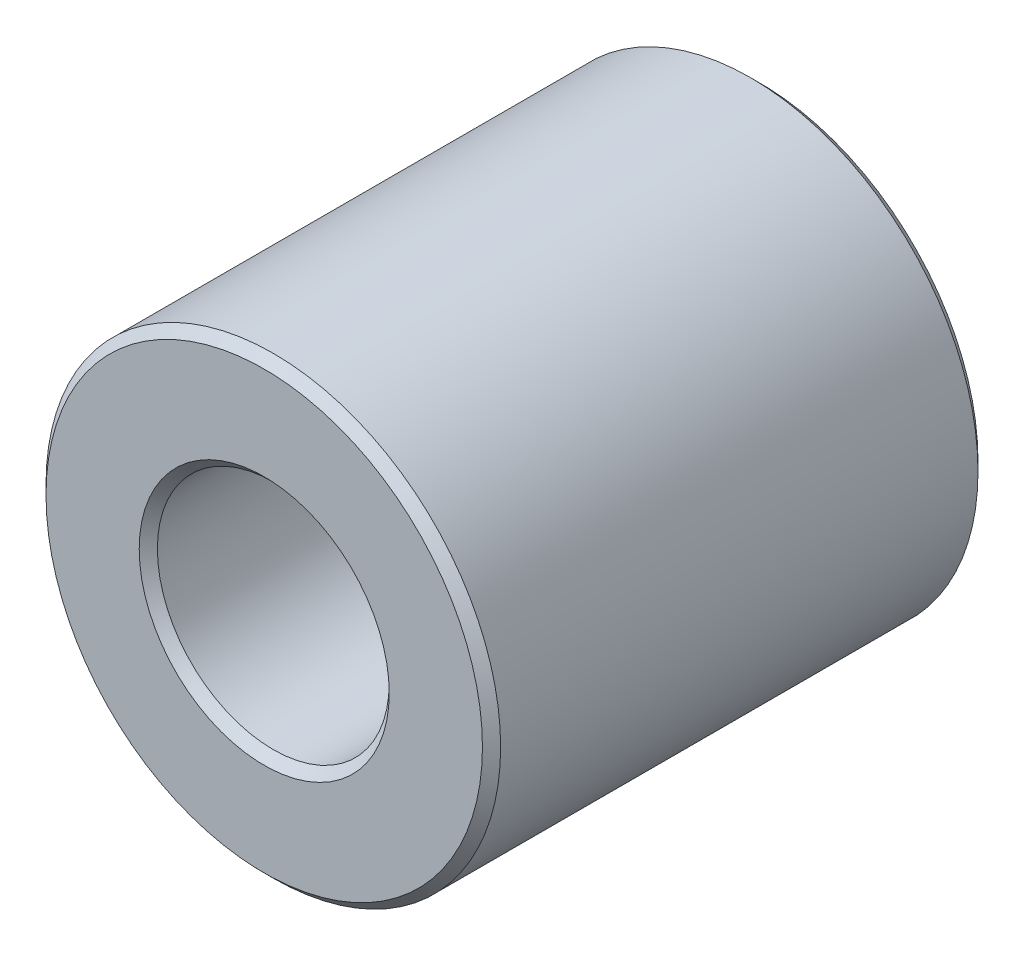
ISO-10303-21;
HEADER;
FILE_DESCRIPTION(('STEP AP214'),'2;1');
FILE_NAME('part.step','',(''),(''),'','','');
FILE_SCHEMA(('AUTOMOTIVE_DESIGN { 1 0 10303 214 1 1 1 1 }'));
ENDSEC;
DATA;
#1=APPLICATION_CONTEXT('core data for automotive mechanical design processes');
#2=APPLICATION_PROTOCOL_DEFINITION('international standard','automotive_design',2000,#1);
#3=PRODUCT_CONTEXT('',#1,'mechanical');
#4=PRODUCT('Part','Part','',(#3));
#5=PRODUCT_RELATED_PRODUCT_CATEGORY('part','',(#4));
#6=PRODUCT_DEFINITION_FORMATION('','',#4);
#7=PRODUCT_DEFINITION_CONTEXT('part definition',#1,'design');
#8=PRODUCT_DEFINITION('design','',#6,#7);
#9=PRODUCT_DEFINITION_SHAPE('','',#8);
#10=(LENGTH_UNIT() NAMED_UNIT(*) SI_UNIT(.MILLI.,.METRE.));
#11=(NAMED_UNIT(*) PLANE_ANGLE_UNIT() SI_UNIT($,.RADIAN.));
#12=(NAMED_UNIT(*) SI_UNIT($,.STERADIAN.) SOLID_ANGLE_UNIT());
#13=UNCERTAINTY_MEASURE_WITH_UNIT(LENGTH_MEASURE(1.E-05),#10,'distance_accuracy_value','');
#14=(GEOMETRIC_REPRESENTATION_CONTEXT(3) GLOBAL_UNCERTAINTY_ASSIGNED_CONTEXT((#13)) GLOBAL_UNIT_ASSIGNED_CONTEXT((#10,
#11,#12)) REPRESENTATION_CONTEXT('',''));
#15=CARTESIAN_POINT('',(0.,0.,0.));
#16=DIRECTION('',(0.,0.,1.));
#17=DIRECTION('',(1.,0.,0.));
#18=AXIS2_PLACEMENT_3D('',#15,#16,#17);
#19=CARTESIAN_POINT('',(0.,0.,10.9));
#20=DIRECTION('',(0.,0.,1.));
#21=DIRECTION('',(1.,0.,0.));
#22=AXIS2_PLACEMENT_3D('',#19,#20,#21);
#23=PLANE('',#22);
#24=CARTESIAN_POINT('',(0.,0.,10.9));
#25=DIRECTION('',(0.,0.,1.));
#26=DIRECTION('',(1.,0.,0.));
#27=AXIS2_PLACEMENT_3D('',#24,#25,#26);
#28=CIRCLE('',#27,2.75);
#29=CARTESIAN_POINT('',(2.75,0.,10.9));
#30=VERTEX_POINT('',#29);
#31=EDGE_CURVE('E10',#30,#30,#28,.F.);
#32=ORIENTED_EDGE('',*,*,#31,.T.);
#33=EDGE_LOOP('',(#32));
#34=FACE_BOUND('',#33,.T.);
#35=CARTESIAN_POINT('',(0.,0.,10.9));
#36=DIRECTION('',(0.,0.,1.));
#37=DIRECTION('',(1.,0.,0.));
#38=AXIS2_PLACEMENT_3D('',#35,#36,#37);
#39=CIRCLE('',#38,4.8);
#40=CARTESIAN_POINT('',(4.8,0.,10.9));
#41=VERTEX_POINT('',#40);
#42=EDGE_CURVE('E37',#41,#41,#39,.T.);
#43=ORIENTED_EDGE('',*,*,#42,.T.);
#44=EDGE_LOOP('',(#43));
#45=FACE_BOUND('',#44,.T.);
#46=ADVANCED_FACE('F30',(#34,#45),#23,.T.);
#47=CARTESIAN_POINT('',(0.,0.,0.));
#48=DIRECTION('',(0.,0.,1.));
#49=DIRECTION('',(1.,0.,0.));
#50=AXIS2_PLACEMENT_3D('',#47,#48,#49);
#51=PLANE('',#50);
#52=CARTESIAN_POINT('',(0.,0.,0.));
#53=DIRECTION('',(0.,0.,1.));
#54=DIRECTION('',(1.,0.,0.));
#55=AXIS2_PLACEMENT_3D('',#52,#53,#54);
#56=CIRCLE('',#55,4.8);
#57=CARTESIAN_POINT('',(4.8,0.,0.));
#58=VERTEX_POINT('',#57);
#59=EDGE_CURVE('E50',#58,#58,#56,.F.);
#60=ORIENTED_EDGE('',*,*,#59,.T.);
#61=EDGE_LOOP('',(#60));
#62=FACE_BOUND('',#61,.T.);
#63=CARTESIAN_POINT('',(0.,0.,0.));
#64=DIRECTION('',(0.,0.,1.));
#65=DIRECTION('',(1.,0.,0.));
#66=AXIS2_PLACEMENT_3D('',#63,#64,#65);
#67=CIRCLE('',#66,2.75);
#68=CARTESIAN_POINT('',(2.75,0.,0.));
#69=VERTEX_POINT('',#68);
#70=EDGE_CURVE('E53',#69,#69,#67,.T.);
#71=ORIENTED_EDGE('',*,*,#70,.T.);
#72=EDGE_LOOP('',(#71));
#73=FACE_BOUND('',#72,.T.);
#74=ADVANCED_FACE('F74',(#62,#73),#51,.F.);
#75=CARTESIAN_POINT('',(0.,0.,10.9));
#76=DIRECTION('',(0.,0.,-1.));
#77=DIRECTION('',(-1.,0.,0.));
#78=AXIS2_PLACEMENT_3D('',#75,#76,#77);
#79=CYLINDRICAL_SURFACE('',#78,5.);
#80=CARTESIAN_POINT('',(0.,0.,0.199999999999999));
#81=DIRECTION('',(0.,0.,1.));
#82=DIRECTION('',(1.,0.,0.));
#83=AXIS2_PLACEMENT_3D('',#80,#81,#82);
#84=CIRCLE('',#83,5.);
#85=CARTESIAN_POINT('',(5.,0.,0.199999999999999));
#86=VERTEX_POINT('',#85);
#87=EDGE_CURVE('E56',#86,#86,#84,.T.);
#88=ORIENTED_EDGE('',*,*,#87,.T.);
#89=EDGE_LOOP('',(#88));
#90=FACE_BOUND('',#89,.T.);
#91=CARTESIAN_POINT('',(0.,0.,10.7));
#92=DIRECTION('',(0.,0.,1.));
#93=DIRECTION('',(1.,0.,0.));
#94=AXIS2_PLACEMENT_3D('',#91,#92,#93);
#95=CIRCLE('',#94,5.);
#96=CARTESIAN_POINT('',(5.,0.,10.7));
#97=VERTEX_POINT('',#96);
#98=EDGE_CURVE('E59',#97,#97,#95,.F.);
#99=ORIENTED_EDGE('',*,*,#98,.T.);
#100=EDGE_LOOP('',(#99));
#101=FACE_BOUND('',#100,.T.);
#102=ADVANCED_FACE('F63',(#90,#101),#79,.T.);
#103=CARTESIAN_POINT('',(0.,0.,10.9));
#104=DIRECTION('',(0.,0.,-1.));
#105=DIRECTION('',(-1.,0.,0.));
#106=AXIS2_PLACEMENT_3D('',#103,#104,#105);
#107=CYLINDRICAL_SURFACE('',#106,2.55);
#108=CARTESIAN_POINT('',(0.,0.,0.200000000000002));
#109=DIRECTION('',(0.,0.,1.));
#110=DIRECTION('',(1.,0.,0.));
#111=AXIS2_PLACEMENT_3D('',#108,#109,#110);
#112=CIRCLE('',#111,2.55);
#113=CARTESIAN_POINT('',(2.55,0.,0.200000000000002));
#114=VERTEX_POINT('',#113);
#115=EDGE_CURVE('E41',#114,#114,#112,.F.);
#116=ORIENTED_EDGE('',*,*,#115,.T.);
#117=EDGE_LOOP('',(#116));
#118=FACE_BOUND('',#117,.T.);
#119=CARTESIAN_POINT('',(0.,0.,10.7));
#120=DIRECTION('',(0.,0.,1.));
#121=DIRECTION('',(1.,0.,0.));
#122=AXIS2_PLACEMENT_3D('',#119,#120,#121);
#123=CIRCLE('',#122,2.55);
#124=CARTESIAN_POINT('',(2.55,0.,10.7));
#125=VERTEX_POINT('',#124);
#126=EDGE_CURVE('E45',#125,#125,#123,.T.);
#127=ORIENTED_EDGE('',*,*,#126,.T.);
#128=EDGE_LOOP('',(#127));
#129=FACE_BOUND('',#128,.T.);
#130=ADVANCED_FACE('F82',(#118,#129),#107,.F.);
#131=CARTESIAN_POINT('',(0.,0.,0.199999999999999));
#132=DIRECTION('',(0.,0.,1.));
#133=DIRECTION('',(1.,0.,0.));
#134=AXIS2_PLACEMENT_3D('',#131,#132,#133);
#135=CONICAL_SURFACE('',#134,5.,0.785398163397446);
#136=ORIENTED_EDGE('',*,*,#59,.F.);
#137=EDGE_LOOP('',(#136));
#138=FACE_BOUND('',#137,.T.);
#139=ORIENTED_EDGE('',*,*,#87,.F.);
#140=EDGE_LOOP('',(#139));
#141=FACE_BOUND('',#140,.T.);
#142=ADVANCED_FACE('F87',(#138,#141),#135,.T.);
#143=CARTESIAN_POINT('',(0.,0.,0.));
#144=DIRECTION('',(0.,0.,-1.));
#145=DIRECTION('',(-1.,0.,0.));
#146=AXIS2_PLACEMENT_3D('',#143,#144,#145);
#147=CONICAL_SURFACE('',#146,2.75,0.785398163397441);
#148=ORIENTED_EDGE('',*,*,#115,.F.);
#149=EDGE_LOOP('',(#148));
#150=FACE_BOUND('',#149,.T.);
#151=ORIENTED_EDGE('',*,*,#70,.F.);
#152=EDGE_LOOP('',(#151));
#153=FACE_BOUND('',#152,.T.);
#154=ADVANCED_FACE('F71',(#150,#153),#147,.F.);
#155=CARTESIAN_POINT('',(0.,0.,10.7));
#156=DIRECTION('',(0.,0.,1.));
#157=DIRECTION('',(1.,0.,0.));
#158=AXIS2_PLACEMENT_3D('',#155,#156,#157);
#159=CONICAL_SURFACE('',#158,2.55,0.785398163397454);
#160=ORIENTED_EDGE('',*,*,#31,.F.);
#161=EDGE_LOOP('',(#160));
#162=FACE_BOUND('',#161,.T.);
#163=ORIENTED_EDGE('',*,*,#126,.F.);
#164=EDGE_LOOP('',(#163));
#165=FACE_BOUND('',#164,.T.);
#166=ADVANCED_FACE('F67',(#162,#165),#159,.F.);
#167=CARTESIAN_POINT('',(0.,0.,10.9));
#168=DIRECTION('',(0.,0.,-1.));
#169=DIRECTION('',(-1.,0.,0.));
#170=AXIS2_PLACEMENT_3D('',#167,#168,#169);
#171=CONICAL_SURFACE('',#170,4.8,0.785398163397442);
#172=ORIENTED_EDGE('',*,*,#98,.F.);
#173=EDGE_LOOP('',(#172));
#174=FACE_BOUND('',#173,.T.);
#175=ORIENTED_EDGE('',*,*,#42,.F.);
#176=EDGE_LOOP('',(#175));
#177=FACE_BOUND('',#176,.T.);
#178=ADVANCED_FACE('F32',(#174,#177),#171,.T.);
#179=CLOSED_SHELL('',(#46,#74,#102,#130,#142,#154,#166,#178));
#180=MANIFOLD_SOLID_BREP('B2',#179);
#181=ADVANCED_BREP_SHAPE_REPRESENTATION('',(#18,#180),#14);
#182=SHAPE_DEFINITION_REPRESENTATION(#9,#181);
ENDSEC;
END-ISO-10303-21;
